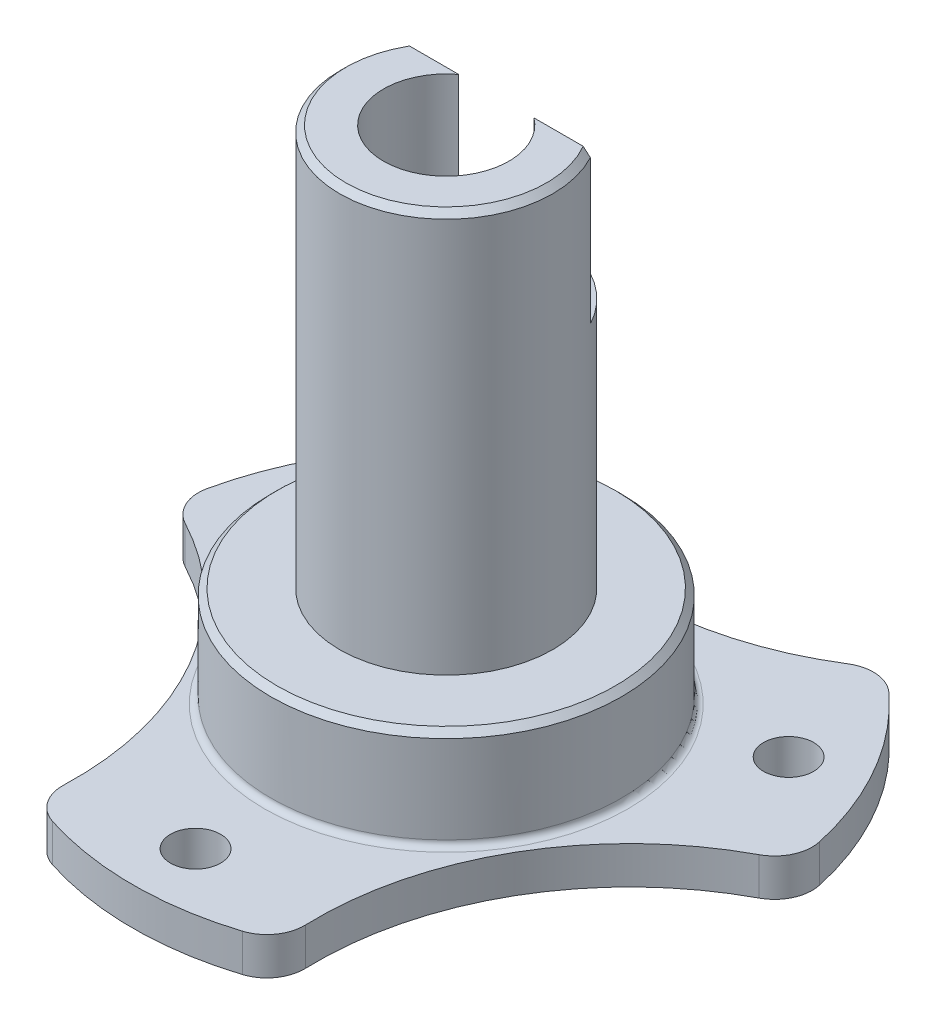
ISO-10303-21;
HEADER;
FILE_DESCRIPTION(('STEP AP214'),'2;1');
FILE_NAME('part.step','',(''),(''),'','','');
FILE_SCHEMA(('AUTOMOTIVE_DESIGN { 1 0 10303 214 1 1 1 1 }'));
ENDSEC;
DATA;
#1=APPLICATION_CONTEXT('core data for automotive mechanical design processes');
#2=APPLICATION_PROTOCOL_DEFINITION('international standard','automotive_design',2000,#1);
#3=PRODUCT_CONTEXT('',#1,'mechanical');
#4=PRODUCT('Part','Part','',(#3));
#5=PRODUCT_RELATED_PRODUCT_CATEGORY('part','',(#4));
#6=PRODUCT_DEFINITION_FORMATION('','',#4);
#7=PRODUCT_DEFINITION_CONTEXT('part definition',#1,'design');
#8=PRODUCT_DEFINITION('design','',#6,#7);
#9=PRODUCT_DEFINITION_SHAPE('','',#8);
#10=(LENGTH_UNIT() NAMED_UNIT(*) SI_UNIT(.MILLI.,.METRE.));
#11=(NAMED_UNIT(*) PLANE_ANGLE_UNIT() SI_UNIT($,.RADIAN.));
#12=(NAMED_UNIT(*) SI_UNIT($,.STERADIAN.) SOLID_ANGLE_UNIT());
#13=UNCERTAINTY_MEASURE_WITH_UNIT(LENGTH_MEASURE(1.E-05),#10,'distance_accuracy_value','');
#14=(GEOMETRIC_REPRESENTATION_CONTEXT(3) GLOBAL_UNCERTAINTY_ASSIGNED_CONTEXT((#13)) GLOBAL_UNIT_ASSIGNED_CONTEXT((#10,
#11,#12)) REPRESENTATION_CONTEXT('',''));
#15=CARTESIAN_POINT('',(0.,0.,0.));
#16=DIRECTION('',(0.,0.,1.));
#17=DIRECTION('',(1.,0.,0.));
#18=AXIS2_PLACEMENT_3D('',#15,#16,#17);
#19=CARTESIAN_POINT('',(0.,-3.,0.));
#20=DIRECTION('',(0.,1.,0.));
#21=DIRECTION('',(0.,0.,1.));
#22=AXIS2_PLACEMENT_3D('',#19,#20,#21);
#23=CYLINDRICAL_SURFACE('',#22,25.);
#24=CARTESIAN_POINT('',(0.,-3.,0.));
#25=DIRECTION('',(0.,-1.,0.));
#26=DIRECTION('',(0.,0.,-1.));
#27=AXIS2_PLACEMENT_3D('',#24,#25,#26);
#28=CIRCLE('',#27,25.);
#29=CARTESIAN_POINT('',(-24.4182474846353,-3.,-5.361827093361));
#30=VERTEX_POINT('',#29);
#31=CARTESIAN_POINT('',(-16.8526022158681,-3.,-18.4659090909091));
#32=VERTEX_POINT('',#31);
#33=EDGE_CURVE('E239',#30,#32,#28,.T.);
#34=ORIENTED_EDGE('',*,*,#33,.F.);
#35=DIRECTION('',(0.,1.,0.));
#36=VECTOR('',#35,1.);
#37=CARTESIAN_POINT('',(-24.4182474846353,-3.,-5.361827093361));
#38=LINE('',#37,#36);
#39=CARTESIAN_POINT('',(-24.4182474846353,0.,-5.361827093361));
#40=VERTEX_POINT('',#39);
#41=EDGE_CURVE('E279',#30,#40,#38,.T.);
#42=ORIENTED_EDGE('',*,*,#41,.T.);
#43=CARTESIAN_POINT('',(0.,0.,0.));
#44=DIRECTION('',(0.,-1.,0.));
#45=DIRECTION('',(0.,0.,-1.));
#46=AXIS2_PLACEMENT_3D('',#43,#44,#45);
#47=CIRCLE('',#46,25.);
#48=CARTESIAN_POINT('',(-16.8526022158681,0.,-18.4659090909091));
#49=VERTEX_POINT('',#48);
#50=EDGE_CURVE('E202',#40,#49,#47,.T.);
#51=ORIENTED_EDGE('',*,*,#50,.T.);
#52=DIRECTION('',(0.,1.,0.));
#53=VECTOR('',#52,1.);
#54=CARTESIAN_POINT('',(-16.8526022158681,-3.,-18.4659090909091));
#55=LINE('',#54,#53);
#56=EDGE_CURVE('E276',#49,#32,#55,.F.);
#57=ORIENTED_EDGE('',*,*,#56,.T.);
#58=EDGE_LOOP('',(#34,#42,#51,#57));
#59=FACE_BOUND('',#58,.T.);
#60=ADVANCED_FACE('F47',(#59),#23,.T.);
#61=CARTESIAN_POINT('',(16.8526022158681,-3.,-18.4659090909091));
#62=VERTEX_POINT('',#61);
#63=CARTESIAN_POINT('',(24.4182474846353,-3.,-5.36182709336134));
#64=VERTEX_POINT('',#63);
#65=EDGE_CURVE('E238',#62,#64,#28,.T.);
#66=ORIENTED_EDGE('',*,*,#65,.F.);
#67=DIRECTION('',(0.,1.,0.));
#68=VECTOR('',#67,1.);
#69=CARTESIAN_POINT('',(16.8526022158681,-3.,-18.4659090909091));
#70=LINE('',#69,#68);
#71=CARTESIAN_POINT('',(16.8526022158681,0.,-18.4659090909091));
#72=VERTEX_POINT('',#71);
#73=EDGE_CURVE('E317',#62,#72,#70,.T.);
#74=ORIENTED_EDGE('',*,*,#73,.T.);
#75=CARTESIAN_POINT('',(24.4182474846353,0.,-5.36182709336134));
#76=VERTEX_POINT('',#75);
#77=EDGE_CURVE('E243',#72,#76,#47,.T.);
#78=ORIENTED_EDGE('',*,*,#77,.T.);
#79=DIRECTION('',(0.,1.,0.));
#80=VECTOR('',#79,1.);
#81=CARTESIAN_POINT('',(24.4182474846353,-3.,-5.36182709336134));
#82=LINE('',#81,#80);
#83=EDGE_CURVE('E314',#76,#64,#82,.F.);
#84=ORIENTED_EDGE('',*,*,#83,.T.);
#85=EDGE_LOOP('',(#66,#74,#78,#84));
#86=FACE_BOUND('',#85,.T.);
#87=ADVANCED_FACE('F376',(#86),#23,.T.);
#88=CARTESIAN_POINT('',(0.,28.,0.));
#89=DIRECTION('',(0.,1.,0.));
#90=DIRECTION('',(0.,0.,1.));
#91=AXIS2_PLACEMENT_3D('',#88,#89,#90);
#92=PLANE('',#91);
#93=CARTESIAN_POINT('',(0.,28.,0.));
#94=DIRECTION('',(0.,1.,0.));
#95=DIRECTION('',(0.,0.,1.));
#96=AXIS2_PLACEMENT_3D('',#93,#94,#95);
#97=CIRCLE('',#96,8.5);
#98=CARTESIAN_POINT('',(7.5,28.,-4.));
#99=VERTEX_POINT('',#98);
#100=CARTESIAN_POINT('',(-7.5,28.,-4.));
#101=VERTEX_POINT('',#100);
#102=EDGE_CURVE('E264',#99,#101,#97,.T.);
#103=ORIENTED_EDGE('',*,*,#102,.T.);
#104=DIRECTION('',(1.,0.,0.));
#105=VECTOR('',#104,1.);
#106=CARTESIAN_POINT('',(0.,28.,-4.));
#107=LINE('',#106,#105);
#108=CARTESIAN_POINT('',(-3.,28.,-4.));
#109=VERTEX_POINT('',#108);
#110=EDGE_CURVE('E247',#101,#109,#107,.T.);
#111=ORIENTED_EDGE('',*,*,#110,.T.);
#112=CARTESIAN_POINT('',(0.,28.,0.));
#113=DIRECTION('',(0.,1.,0.));
#114=DIRECTION('',(0.,0.,1.));
#115=AXIS2_PLACEMENT_3D('',#112,#113,#114);
#116=CIRCLE('',#115,5.);
#117=CARTESIAN_POINT('',(3.,28.,-4.));
#118=VERTEX_POINT('',#117);
#119=EDGE_CURVE('E177',#118,#109,#116,.T.);
#120=ORIENTED_EDGE('',*,*,#119,.F.);
#121=EDGE_CURVE('E182',#118,#99,#107,.T.);
#122=ORIENTED_EDGE('',*,*,#121,.T.);
#123=EDGE_LOOP('',(#103,#111,#120,#122));
#124=FACE_BOUND('',#123,.T.);
#125=ADVANCED_FACE('F368',(#124),#92,.T.);
#126=CARTESIAN_POINT('',(0.,21.,0.));
#127=DIRECTION('',(0.,1.,0.));
#128=DIRECTION('',(0.,0.,1.));
#129=AXIS2_PLACEMENT_3D('',#126,#127,#128);
#130=CYLINDRICAL_SURFACE('',#129,2.75);
#131=CARTESIAN_POINT('',(0.,21.,0.));
#132=DIRECTION('',(0.,1.,0.));
#133=DIRECTION('',(0.,0.,1.));
#134=AXIS2_PLACEMENT_3D('',#131,#132,#133);
#135=CIRCLE('',#134,2.75);
#136=CARTESIAN_POINT('',(0.,21.,2.75));
#137=VERTEX_POINT('',#136);
#138=EDGE_CURVE('E260',#137,#137,#135,.T.);
#139=ORIENTED_EDGE('',*,*,#138,.F.);
#140=EDGE_LOOP('',(#139));
#141=FACE_BOUND('',#140,.T.);
#142=CARTESIAN_POINT('',(0.,24.7,0.));
#143=DIRECTION('',(0.,1.,0.));
#144=DIRECTION('',(0.,0.,1.));
#145=AXIS2_PLACEMENT_3D('',#142,#143,#144);
#146=CIRCLE('',#145,2.75);
#147=CARTESIAN_POINT('',(0.,24.7,2.75));
#148=VERTEX_POINT('',#147);
#149=EDGE_CURVE('E254',#148,#148,#146,.T.);
#150=ORIENTED_EDGE('',*,*,#149,.T.);
#151=EDGE_LOOP('',(#150));
#152=FACE_BOUND('',#151,.T.);
#153=ADVANCED_FACE('F364',(#141,#152),#130,.F.);
#154=CARTESIAN_POINT('',(0.,8.,0.));
#155=DIRECTION('',(0.,-1.,0.));
#156=DIRECTION('',(0.,0.,-1.));
#157=AXIS2_PLACEMENT_3D('',#154,#155,#156);
#158=CYLINDRICAL_SURFACE('',#157,14.);
#159=CARTESIAN_POINT('',(0.,0.5,0.));
#160=DIRECTION('',(0.,-1.,0.));
#161=DIRECTION('',(0.,0.,-1.));
#162=AXIS2_PLACEMENT_3D('',#159,#160,#161);
#163=CIRCLE('',#162,14.);
#164=CARTESIAN_POINT('',(0.,0.5,-14.));
#165=VERTEX_POINT('',#164);
#166=EDGE_CURVE('E330',#165,#165,#163,.F.);
#167=ORIENTED_EDGE('',*,*,#166,.T.);
#168=EDGE_LOOP('',(#167));
#169=FACE_BOUND('',#168,.T.);
#170=CARTESIAN_POINT('',(0.,7.49999999999999,0.));
#171=DIRECTION('',(0.,1.,0.));
#172=DIRECTION('',(0.,0.,1.));
#173=AXIS2_PLACEMENT_3D('',#170,#171,#172);
#174=CIRCLE('',#173,14.);
#175=CARTESIAN_POINT('',(0.,7.49999999999999,14.));
#176=VERTEX_POINT('',#175);
#177=EDGE_CURVE('E273',#176,#176,#174,.F.);
#178=ORIENTED_EDGE('',*,*,#177,.T.);
#179=EDGE_LOOP('',(#178));
#180=FACE_BOUND('',#179,.T.);
#181=ADVANCED_FACE('F367',(#169,#180),#158,.T.);
#182=CARTESIAN_POINT('',(0.,8.,0.));
#183=DIRECTION('',(0.,1.,0.));
#184=DIRECTION('',(0.,0.,1.));
#185=AXIS2_PLACEMENT_3D('',#182,#183,#184);
#186=PLANE('',#185);
#187=CARTESIAN_POINT('',(0.,8.,0.));
#188=DIRECTION('',(0.,1.,0.));
#189=DIRECTION('',(0.,0.,1.));
#190=AXIS2_PLACEMENT_3D('',#187,#188,#189);
#191=CIRCLE('',#190,13.5);
#192=CARTESIAN_POINT('',(0.,8.,13.5));
#193=VERTEX_POINT('',#192);
#194=EDGE_CURVE('E270',#193,#193,#191,.T.);
#195=ORIENTED_EDGE('',*,*,#194,.T.);
#196=EDGE_LOOP('',(#195));
#197=FACE_BOUND('',#196,.T.);
#198=CARTESIAN_POINT('',(0.,8.,0.));
#199=DIRECTION('',(0.,1.,0.));
#200=DIRECTION('',(0.,0.,1.));
#201=AXIS2_PLACEMENT_3D('',#198,#199,#200);
#202=CIRCLE('',#201,8.5);
#203=CARTESIAN_POINT('',(0.,8.,8.5));
#204=VERTEX_POINT('',#203);
#205=EDGE_CURVE('E267',#204,#204,#202,.T.);
#206=ORIENTED_EDGE('',*,*,#205,.F.);
#207=EDGE_LOOP('',(#206));
#208=FACE_BOUND('',#207,.T.);
#209=ADVANCED_FACE('F380',(#197,#208),#186,.T.);
#210=CARTESIAN_POINT('',(0.,28.,0.));
#211=DIRECTION('',(0.,-1.,0.));
#212=DIRECTION('',(0.,0.,-1.));
#213=AXIS2_PLACEMENT_3D('',#210,#211,#212);
#214=CYLINDRICAL_SURFACE('',#213,8.5);
#215=DIRECTION('',(0.,-1.,0.));
#216=VECTOR('',#215,1.);
#217=CARTESIAN_POINT('',(7.5,34.,-4.));
#218=LINE('',#217,#216);
#219=CARTESIAN_POINT('',(7.5,39.5,-4.));
#220=VERTEX_POINT('',#219);
#221=EDGE_CURVE('E250',#220,#99,#218,.T.);
#222=ORIENTED_EDGE('',*,*,#221,.F.);
#223=CARTESIAN_POINT('',(0.,39.5,0.));
#224=DIRECTION('',(0.,1.,0.));
#225=DIRECTION('',(0.,0.,1.));
#226=AXIS2_PLACEMENT_3D('',#223,#224,#225);
#227=CIRCLE('',#226,8.5);
#228=CARTESIAN_POINT('',(-7.5,39.5,-4.));
#229=VERTEX_POINT('',#228);
#230=EDGE_CURVE('E62',#220,#229,#227,.F.);
#231=ORIENTED_EDGE('',*,*,#230,.T.);
#232=DIRECTION('',(0.,-1.,0.));
#233=VECTOR('',#232,1.);
#234=CARTESIAN_POINT('',(-7.5,34.,-4.));
#235=LINE('',#234,#233);
#236=EDGE_CURVE('E252',#229,#101,#235,.T.);
#237=ORIENTED_EDGE('',*,*,#236,.T.);
#238=ORIENTED_EDGE('',*,*,#102,.F.);
#239=EDGE_LOOP('',(#222,#231,#237,#238));
#240=FACE_BOUND('',#239,.T.);
#241=ORIENTED_EDGE('',*,*,#205,.T.);
#242=EDGE_LOOP('',(#241));
#243=FACE_BOUND('',#242,.T.);
#244=ADVANCED_FACE('F372',(#240,#243),#214,.T.);
#245=CARTESIAN_POINT('',(0.,21.,0.));
#246=DIRECTION('',(0.,1.,0.));
#247=DIRECTION('',(0.,0.,1.));
#248=AXIS2_PLACEMENT_3D('',#245,#246,#247);
#249=PLANE('',#248);
#250=ORIENTED_EDGE('',*,*,#138,.T.);
#251=EDGE_LOOP('',(#250));
#252=FACE_BOUND('',#251,.T.);
#253=CARTESIAN_POINT('',(0.,21.,0.));
#254=DIRECTION('',(0.,-1.,0.));
#255=DIRECTION('',(0.,0.,-1.));
#256=AXIS2_PLACEMENT_3D('',#253,#254,#255);
#257=CIRCLE('',#256,6.);
#258=CARTESIAN_POINT('',(0.,21.,-6.));
#259=VERTEX_POINT('',#258);
#260=EDGE_CURVE('E244',#259,#259,#257,.T.);
#261=ORIENTED_EDGE('',*,*,#260,.T.);
#262=EDGE_LOOP('',(#261));
#263=FACE_BOUND('',#262,.T.);
#264=ADVANCED_FACE('F362',(#252,#263),#249,.F.);
#265=CARTESIAN_POINT('',(0.,24.7,0.));
#266=DIRECTION('',(0.,1.,0.));
#267=DIRECTION('',(0.,0.,1.));
#268=AXIS2_PLACEMENT_3D('',#265,#266,#267);
#269=CYLINDRICAL_SURFACE('',#268,5.);
#270=CARTESIAN_POINT('',(0.,24.7,0.));
#271=DIRECTION('',(0.,1.,0.));
#272=DIRECTION('',(0.,0.,1.));
#273=AXIS2_PLACEMENT_3D('',#270,#271,#272);
#274=CIRCLE('',#273,5.);
#275=CARTESIAN_POINT('',(0.,24.7,5.));
#276=VERTEX_POINT('',#275);
#277=EDGE_CURVE('E257',#276,#276,#274,.T.);
#278=ORIENTED_EDGE('',*,*,#277,.F.);
#279=EDGE_LOOP('',(#278));
#280=FACE_BOUND('',#279,.T.);
#281=ORIENTED_EDGE('',*,*,#119,.T.);
#282=DIRECTION('',(0.,-1.,0.));
#283=VECTOR('',#282,1.);
#284=CARTESIAN_POINT('',(-3.,34.,-4.));
#285=LINE('',#284,#283);
#286=CARTESIAN_POINT('',(-3.,40.,-4.));
#287=VERTEX_POINT('',#286);
#288=EDGE_CURVE('E171',#287,#109,#285,.T.);
#289=ORIENTED_EDGE('',*,*,#288,.F.);
#290=CARTESIAN_POINT('',(0.,40.,0.));
#291=DIRECTION('',(0.,-1.,0.));
#292=DIRECTION('',(0.,0.,1.));
#293=AXIS2_PLACEMENT_3D('',#290,#291,#292);
#294=CIRCLE('',#293,5.);
#295=CARTESIAN_POINT('',(3.,40.,-4.));
#296=VERTEX_POINT('',#295);
#297=EDGE_CURVE('E175',#296,#287,#294,.T.);
#298=ORIENTED_EDGE('',*,*,#297,.F.);
#299=DIRECTION('',(0.,-1.,0.));
#300=VECTOR('',#299,1.);
#301=CARTESIAN_POINT('',(3.,34.,-4.));
#302=LINE('',#301,#300);
#303=EDGE_CURVE('E181',#296,#118,#302,.T.);
#304=ORIENTED_EDGE('',*,*,#303,.T.);
#305=EDGE_LOOP('',(#281,#289,#298,#304));
#306=FACE_BOUND('',#305,.T.);
#307=ADVANCED_FACE('F173',(#280,#306),#269,.F.);
#308=CARTESIAN_POINT('',(0.,24.7,0.));
#309=DIRECTION('',(0.,1.,0.));
#310=DIRECTION('',(0.,0.,1.));
#311=AXIS2_PLACEMENT_3D('',#308,#309,#310);
#312=PLANE('',#311);
#313=ORIENTED_EDGE('',*,*,#149,.F.);
#314=EDGE_LOOP('',(#313));
#315=FACE_BOUND('',#314,.T.);
#316=ORIENTED_EDGE('',*,*,#277,.T.);
#317=EDGE_LOOP('',(#316));
#318=FACE_BOUND('',#317,.T.);
#319=ADVANCED_FACE('F355',(#315,#318),#312,.T.);
#320=CARTESIAN_POINT('',(0.,34.,-4.));
#321=DIRECTION('',(0.,0.,-1.));
#322=DIRECTION('',(-1.,0.,0.));
#323=AXIS2_PLACEMENT_3D('',#320,#321,#322);
#324=PLANE('',#323);
#325=ORIENTED_EDGE('',*,*,#236,.F.);
#326=CARTESIAN_POINT('',(-7.5,39.5,-4.));
#327=CARTESIAN_POINT('',(-7.40508572762608,39.583773802137,-4.));
#328=CARTESIAN_POINT('',(-7.30997886837291,39.6673273631633,-4.));
#329=CARTESIAN_POINT('',(-7.11937994525611,39.8339940299726,-4.));
#330=CARTESIAN_POINT('',(-7.02388788126778,39.9171071356129,-4.));
#331=CARTESIAN_POINT('',(-6.92820323027551,40.,-4.));
#332=B_SPLINE_CURVE_WITH_KNOTS('',3,(#326,#327,#328,#329,#330,#331),.UNSPECIFIED.,.F.,.F.,(4,2,
4),(0.,0.379787585545629,0.759575294042707),.UNSPECIFIED.);
#333=CARTESIAN_POINT('',(-6.92820323027551,40.,-4.));
#334=VERTEX_POINT('',#333);
#335=EDGE_CURVE('E11',#229,#334,#332,.T.);
#336=ORIENTED_EDGE('',*,*,#335,.T.);
#337=DIRECTION('',(-1.,0.,0.));
#338=VECTOR('',#337,1.);
#339=CARTESIAN_POINT('',(-7.5,40.,-4.));
#340=LINE('',#339,#338);
#341=EDGE_CURVE('E185',#287,#334,#340,.T.);
#342=ORIENTED_EDGE('',*,*,#341,.F.);
#343=ORIENTED_EDGE('',*,*,#288,.T.);
#344=ORIENTED_EDGE('',*,*,#110,.F.);
#345=EDGE_LOOP('',(#325,#336,#342,#343,#344));
#346=FACE_BOUND('',#345,.T.);
#347=ADVANCED_FACE('F186',(#346),#324,.T.);
#348=DIRECTION('',(-1.,0.,0.));
#349=VECTOR('',#348,1.);
#350=CARTESIAN_POINT('',(3.,40.,-4.));
#351=LINE('',#350,#349);
#352=CARTESIAN_POINT('',(6.92820323027551,40.,-4.));
#353=VERTEX_POINT('',#352);
#354=EDGE_CURVE('E191',#353,#296,#351,.T.);
#355=ORIENTED_EDGE('',*,*,#354,.F.);
#356=CARTESIAN_POINT('',(6.92820323027551,40.,-4.));
#357=CARTESIAN_POINT('',(7.02388788126778,39.9171071356129,-4.));
#358=CARTESIAN_POINT('',(7.11937994525611,39.8339940299726,-4.));
#359=CARTESIAN_POINT('',(7.30997886837291,39.6673273631633,-4.));
#360=CARTESIAN_POINT('',(7.40508572762608,39.583773802137,-4.));
#361=CARTESIAN_POINT('',(7.5,39.5,-4.));
#362=B_SPLINE_CURVE_WITH_KNOTS('',3,(#356,#357,#358,#359,#360,#361),.UNSPECIFIED.,.F.,.F.,(4,2,
4),(0.,0.379787708497077,0.759575294042706),.UNSPECIFIED.);
#363=EDGE_CURVE('E76',#353,#220,#362,.T.);
#364=ORIENTED_EDGE('',*,*,#363,.T.);
#365=ORIENTED_EDGE('',*,*,#221,.T.);
#366=ORIENTED_EDGE('',*,*,#121,.F.);
#367=ORIENTED_EDGE('',*,*,#303,.F.);
#368=EDGE_LOOP('',(#355,#364,#365,#366,#367));
#369=FACE_BOUND('',#368,.T.);
#370=ADVANCED_FACE('F348',(#369),#324,.T.);
#371=CARTESIAN_POINT('',(0.,21.,0.));
#372=DIRECTION('',(0.,-1.,0.));
#373=DIRECTION('',(0.,0.,-1.));
#374=AXIS2_PLACEMENT_3D('',#371,#372,#373);
#375=CYLINDRICAL_SURFACE('',#374,6.);
#376=CARTESIAN_POINT('',(0.,-2.49999999999997,0.));
#377=DIRECTION('',(0.,-1.,0.));
#378=DIRECTION('',(0.,0.,-1.));
#379=AXIS2_PLACEMENT_3D('',#376,#377,#378);
#380=CIRCLE('',#379,6.);
#381=CARTESIAN_POINT('',(0.,-2.49999999999997,-6.));
#382=VERTEX_POINT('',#381);
#383=EDGE_CURVE('E336',#382,#382,#380,.T.);
#384=CARTESIAN_POINT('',(0.,-2.49999999999997,-6.));
#385=CARTESIAN_POINT('',(0.,-2.2552083333333,-6.));
#386=CARTESIAN_POINT('',(0.,-2.01041666666663,-6.));
#387=CARTESIAN_POINT('',(0.,-1.5208333333333,-6.));
#388=CARTESIAN_POINT('',(0.,-1.27604166666664,-6.));
#389=CARTESIAN_POINT('',(0.,-0.786458333333303,-6.));
#390=CARTESIAN_POINT('',(0.,-0.541666666666637,-6.));
#391=CARTESIAN_POINT('',(0.,-0.0520833333333044,-6.));
#392=CARTESIAN_POINT('',(0.,0.192708333333362,-6.));
#393=CARTESIAN_POINT('',(0.,0.682291666666694,-6.));
#394=CARTESIAN_POINT('',(0.,0.927083333333361,-6.));
#395=CARTESIAN_POINT('',(0.,1.41666666666669,-6.));
#396=CARTESIAN_POINT('',(0.,1.66145833333336,-6.));
#397=CARTESIAN_POINT('',(0.,2.15104166666669,-6.));
#398=CARTESIAN_POINT('',(0.,2.39583333333336,-6.));
#399=CARTESIAN_POINT('',(0.,2.88541666666669,-6.));
#400=CARTESIAN_POINT('',(0.,3.13020833333336,-6.));
#401=CARTESIAN_POINT('',(0.,3.61979166666669,-6.));
#402=CARTESIAN_POINT('',(0.,3.86458333333336,-6.));
#403=CARTESIAN_POINT('',(0.,4.35416666666669,-6.));
#404=CARTESIAN_POINT('',(0.,4.59895833333336,-6.));
#405=CARTESIAN_POINT('',(0.,5.08854166666669,-6.));
#406=CARTESIAN_POINT('',(0.,5.33333333333335,-6.));
#407=CARTESIAN_POINT('',(0.,5.82291666666669,-6.));
#408=CARTESIAN_POINT('',(0.,6.06770833333335,-6.));
#409=CARTESIAN_POINT('',(0.,6.55729166666669,-6.));
#410=CARTESIAN_POINT('',(0.,6.80208333333335,-6.));
#411=CARTESIAN_POINT('',(0.,7.29166666666669,-6.));
#412=CARTESIAN_POINT('',(0.,7.53645833333335,-6.));
#413=CARTESIAN_POINT('',(0.,8.02604166666669,-6.));
#414=CARTESIAN_POINT('',(0.,8.27083333333335,-6.));
#415=CARTESIAN_POINT('',(0.,8.76041666666668,-6.));
#416=CARTESIAN_POINT('',(0.,9.00520833333335,-6.));
#417=CARTESIAN_POINT('',(0.,9.49479166666668,-6.));
#418=CARTESIAN_POINT('',(0.,9.73958333333335,-6.));
#419=CARTESIAN_POINT('',(0.,10.2291666666667,-6.));
#420=CARTESIAN_POINT('',(0.,10.4739583333333,-6.));
#421=CARTESIAN_POINT('',(0.,10.9635416666667,-6.));
#422=CARTESIAN_POINT('',(0.,11.2083333333333,-6.));
#423=CARTESIAN_POINT('',(0.,11.6979166666667,-6.));
#424=CARTESIAN_POINT('',(0.,11.9427083333333,-6.));
#425=CARTESIAN_POINT('',(0.,12.4322916666667,-6.));
#426=CARTESIAN_POINT('',(0.,12.6770833333333,-6.));
#427=CARTESIAN_POINT('',(0.,13.1666666666667,-6.));
#428=CARTESIAN_POINT('',(0.,13.4114583333333,-6.));
#429=CARTESIAN_POINT('',(0.,13.9010416666667,-6.));
#430=CARTESIAN_POINT('',(0.,14.1458333333333,-6.));
#431=CARTESIAN_POINT('',(0.,14.6354166666667,-6.));
#432=CARTESIAN_POINT('',(0.,14.8802083333333,-6.));
#433=CARTESIAN_POINT('',(0.,15.3697916666667,-6.));
#434=CARTESIAN_POINT('',(0.,15.6145833333333,-6.));
#435=CARTESIAN_POINT('',(0.,16.1041666666667,-6.));
#436=CARTESIAN_POINT('',(0.,16.3489583333333,-6.));
#437=CARTESIAN_POINT('',(0.,16.8385416666667,-6.));
#438=CARTESIAN_POINT('',(0.,17.0833333333333,-6.));
#439=CARTESIAN_POINT('',(0.,17.5729166666667,-6.));
#440=CARTESIAN_POINT('',(0.,17.8177083333333,-6.));
#441=CARTESIAN_POINT('',(0.,18.3072916666667,-6.));
#442=CARTESIAN_POINT('',(0.,18.5520833333333,-6.));
#443=CARTESIAN_POINT('',(0.,19.0416666666667,-6.));
#444=CARTESIAN_POINT('',(0.,19.2864583333333,-6.));
#445=CARTESIAN_POINT('',(0.,19.7760416666667,-6.));
#446=CARTESIAN_POINT('',(0.,20.0208333333333,-6.));
#447=CARTESIAN_POINT('',(0.,20.5104166666667,-6.));
#448=CARTESIAN_POINT('',(0.,20.7552083333333,-6.));
#449=CARTESIAN_POINT('',(0.,21.,-6.));
#450=B_SPLINE_CURVE_WITH_KNOTS('',3,(#384,#385,#386,#387,#388,#389,#390,#391,#392,#393,#394,
#395,#396,#397,#398,#399,#400,#401,#402,#403,#404,#405,#406,#407,#408,#409,#410,#411,#412,#413,
#414,#415,#416,#417,#418,#419,#420,#421,#422,#423,#424,#425,#426,#427,#428,#429,#430,#431,#432,
#433,#434,#435,#436,#437,#438,#439,#440,#441,#442,#443,#444,#445,#446,#447,#448,#449),
.UNSPECIFIED.,.F.,.F.,(4,2,2,2,2,2,2,2,2,2,2,2,2,2,2,2,2,2,2,2,2,2,2,2,2,2,2,2,2,2,2,2,4),(0.,
0.734374999999999,1.46875,2.203125,2.9375,3.67187499999999,4.40624999999999,5.140625,
5.87499999999999,6.60937499999999,7.34374999999999,8.07812499999999,8.81249999999999,
9.54687499999999,10.28125,11.015625,11.75,12.484375,13.21875,13.953125,14.6875,15.421875,
16.15625,16.890625,17.625,18.359375,19.09375,19.828125,20.5625,21.296875,22.03125,22.765625,
23.5),.UNSPECIFIED.);
#451=EDGE_CURVE('BSEAM353',#382,#259,#450,.T.);
#452=ORIENTED_EDGE('',*,*,#383,.T.);
#453=ORIENTED_EDGE('',*,*,#260,.F.);
#454=ORIENTED_EDGE('',*,*,#451,.T.);
#455=ORIENTED_EDGE('',*,*,#451,.F.);
#456=EDGE_LOOP('',(#452,#454,#453,#455));
#457=FACE_BOUND('',#456,.T.);
#458=ADVANCED_FACE('F353',(#457),#375,.F.);
#459=CARTESIAN_POINT('',(0.,8.,0.));
#460=DIRECTION('',(0.,-1.,0.));
#461=DIRECTION('',(0.,0.,-1.));
#462=AXIS2_PLACEMENT_3D('',#459,#460,#461);
#463=CONICAL_SURFACE('',#462,13.5,0.785398163397448);
#464=ORIENTED_EDGE('',*,*,#177,.F.);
#465=EDGE_LOOP('',(#464));
#466=FACE_BOUND('',#465,.T.);
#467=ORIENTED_EDGE('',*,*,#194,.F.);
#468=EDGE_LOOP('',(#467));
#469=FACE_BOUND('',#468,.T.);
#470=ADVANCED_FACE('F388',(#466,#469),#463,.T.);
#471=CARTESIAN_POINT('',(0.,0.,0.));
#472=DIRECTION('',(0.,-1.,0.));
#473=DIRECTION('',(0.,0.,-1.));
#474=AXIS2_PLACEMENT_3D('',#471,#472,#473);
#475=PLANE('',#474);
#476=CARTESIAN_POINT('',(0.,0.,0.));
#477=DIRECTION('',(0.,-1.,0.));
#478=DIRECTION('',(0.,0.,-1.));
#479=AXIS2_PLACEMENT_3D('',#476,#477,#478);
#480=CIRCLE('',#479,14.5);
#481=CARTESIAN_POINT('',(0.,0.,-14.5));
#482=VERTEX_POINT('',#481);
#483=EDGE_CURVE('E333',#482,#482,#480,.T.);
#484=ORIENTED_EDGE('',*,*,#483,.T.);
#485=EDGE_LOOP('',(#484));
#486=FACE_BOUND('',#485,.T.);
#487=CARTESIAN_POINT('',(-17.3205080756889,0.,-9.99999999999984));
#488=DIRECTION('',(0.,-1.,0.));
#489=DIRECTION('',(0.,0.,-1.));
#490=AXIS2_PLACEMENT_3D('',#487,#488,#489);
#491=CIRCLE('',#490,2.);
#492=CARTESIAN_POINT('',(-17.3205080756889,0.,-11.9999999999998));
#493=VERTEX_POINT('',#492);
#494=EDGE_CURVE('E207',#493,#493,#491,.T.);
#495=ORIENTED_EDGE('',*,*,#494,.T.);
#496=EDGE_LOOP('',(#495));
#497=FACE_BOUND('',#496,.T.);
#498=CARTESIAN_POINT('',(17.3205080756887,0.,-10.0000000000001));
#499=DIRECTION('',(0.,-1.,0.));
#500=DIRECTION('',(0.,0.,-1.));
#501=AXIS2_PLACEMENT_3D('',#498,#499,#500);
#502=CIRCLE('',#501,2.);
#503=CARTESIAN_POINT('',(17.3205080756887,0.,-12.0000000000001));
#504=VERTEX_POINT('',#503);
#505=EDGE_CURVE('E224',#504,#504,#502,.T.);
#506=ORIENTED_EDGE('',*,*,#505,.T.);
#507=EDGE_LOOP('',(#506));
#508=FACE_BOUND('',#507,.T.);
#509=CARTESIAN_POINT('',(0.,0.,20.));
#510=DIRECTION('',(0.,-1.,0.));
#511=DIRECTION('',(0.,0.,-1.));
#512=AXIS2_PLACEMENT_3D('',#509,#510,#511);
#513=CIRCLE('',#512,2.);
#514=CARTESIAN_POINT('',(0.,0.,18.));
#515=VERTEX_POINT('',#514);
#516=EDGE_CURVE('E206',#515,#515,#513,.T.);
#517=ORIENTED_EDGE('',*,*,#516,.T.);
#518=EDGE_LOOP('',(#517));
#519=FACE_BOUND('',#518,.T.);
#520=ORIENTED_EDGE('',*,*,#50,.F.);
#521=CARTESIAN_POINT('',(-21.4880577864791,0.,-4.71840784215768));
#522=DIRECTION('',(0.,-1.,0.));
#523=DIRECTION('',(0.,0.,-1.));
#524=AXIS2_PLACEMENT_3D('',#521,#522,#523);
#525=CIRCLE('',#524,3.);
#526=CARTESIAN_POINT('',(-22.8973033255754,0.,-2.07000700192648));
#527=VERTEX_POINT('',#526);
#528=EDGE_CURVE('E292',#40,#527,#525,.F.);
#529=ORIENTED_EDGE('',*,*,#528,.T.);
#530=CARTESIAN_POINT('',(-34.6410161513775,0.,20.0000000000002));
#531=DIRECTION('',(0.,-1.,0.));
#532=DIRECTION('',(0.,0.,-1.));
#533=AXIS2_PLACEMENT_3D('',#530,#531,#532);
#534=CIRCLE('',#533,25.);
#535=CARTESIAN_POINT('',(-9.65597301310749,0.,20.8646498590695));
#536=VERTEX_POINT('',#535);
#537=EDGE_CURVE('E218',#527,#536,#534,.T.);
#538=ORIENTED_EDGE('',*,*,#537,.T.);
#539=CARTESIAN_POINT('',(-6.65776783651509,0.,20.9684078421578));
#540=DIRECTION('',(0.,-1.,0.));
#541=DIRECTION('',(0.,0.,-1.));
#542=AXIS2_PLACEMENT_3D('',#539,#540,#541);
#543=CIRCLE('',#542,3.);
#544=CARTESIAN_POINT('',(-7.56564526876715,0.,23.8277361842702));
#545=VERTEX_POINT('',#544);
#546=EDGE_CURVE('E282',#536,#545,#543,.F.);
#547=ORIENTED_EDGE('',*,*,#546,.T.);
#548=CARTESIAN_POINT('',(7.56564526876748,0.,23.8277361842701));
#549=VERTEX_POINT('',#548);
#550=EDGE_CURVE('E240',#549,#545,#47,.T.);
#551=ORIENTED_EDGE('',*,*,#550,.F.);
#552=CARTESIAN_POINT('',(6.65776783651538,0.,20.9684078421577));
#553=DIRECTION('',(0.,-1.,0.));
#554=DIRECTION('',(0.,0.,-1.));
#555=AXIS2_PLACEMENT_3D('',#552,#553,#554);
#556=CIRCLE('',#555,3.);
#557=CARTESIAN_POINT('',(9.65597301310778,0.,20.8646498590694));
#558=VERTEX_POINT('',#557);
#559=EDGE_CURVE('E284',#549,#558,#556,.F.);
#560=ORIENTED_EDGE('',*,*,#559,.T.);
#561=CARTESIAN_POINT('',(34.6410161513777,0.,19.9999999999997));
#562=DIRECTION('',(0.,-1.,0.));
#563=DIRECTION('',(0.,0.,-1.));
#564=AXIS2_PLACEMENT_3D('',#561,#562,#563);
#565=CIRCLE('',#564,25.);
#566=CARTESIAN_POINT('',(22.8973033255753,0.,-2.07000700192681));
#567=VERTEX_POINT('',#566);
#568=EDGE_CURVE('E230',#558,#567,#565,.T.);
#569=ORIENTED_EDGE('',*,*,#568,.T.);
#570=CARTESIAN_POINT('',(21.488057786479,0.,-4.71840784215798));
#571=DIRECTION('',(0.,-1.,0.));
#572=DIRECTION('',(0.,0.,-1.));
#573=AXIS2_PLACEMENT_3D('',#570,#571,#572);
#574=CIRCLE('',#573,3.);
#575=EDGE_CURVE('E286',#567,#76,#574,.F.);
#576=ORIENTED_EDGE('',*,*,#575,.T.);
#577=ORIENTED_EDGE('',*,*,#77,.F.);
#578=CARTESIAN_POINT('',(14.8302899499639,0.,-16.25));
#579=DIRECTION('',(0.,-1.,0.));
#580=DIRECTION('',(0.,0.,-1.));
#581=AXIS2_PLACEMENT_3D('',#578,#579,#580);
#582=CIRCLE('',#581,3.);
#583=CARTESIAN_POINT('',(13.2413303124678,0.,-18.7946428571429));
#584=VERTEX_POINT('',#583);
#585=EDGE_CURVE('E288',#72,#584,#582,.F.);
#586=ORIENTED_EDGE('',*,*,#585,.T.);
#587=CARTESIAN_POINT('',(0.,0.,-40.));
#588=DIRECTION('',(0.,-1.,0.));
#589=DIRECTION('',(0.,0.,-1.));
#590=AXIS2_PLACEMENT_3D('',#587,#588,#589);
#591=CIRCLE('',#590,25.);
#592=CARTESIAN_POINT('',(-13.2413303124678,0.,-18.7946428571429));
#593=VERTEX_POINT('',#592);
#594=EDGE_CURVE('E199',#584,#593,#591,.T.);
#595=ORIENTED_EDGE('',*,*,#594,.T.);
#596=CARTESIAN_POINT('',(-14.8302899499639,0.,-16.25));
#597=DIRECTION('',(0.,-1.,0.));
#598=DIRECTION('',(0.,0.,-1.));
#599=AXIS2_PLACEMENT_3D('',#596,#597,#598);
#600=CIRCLE('',#599,3.);
#601=EDGE_CURVE('E290',#593,#49,#600,.F.);
#602=ORIENTED_EDGE('',*,*,#601,.T.);
#603=EDGE_LOOP('',(#520,#529,#538,#547,#551,#560,#569,#576,#577,#586,#595,#602));
#604=FACE_BOUND('',#603,.T.);
#605=ADVANCED_FACE('F394',(#486,#497,#508,#519,#604),#475,.F.);
#606=CARTESIAN_POINT('',(0.,-3.,0.));
#607=DIRECTION('',(0.,-1.,0.));
#608=DIRECTION('',(0.,0.,-1.));
#609=AXIS2_PLACEMENT_3D('',#606,#607,#608);
#610=PLANE('',#609);
#611=CARTESIAN_POINT('',(0.,-3.,0.));
#612=DIRECTION('',(0.,-1.,0.));
#613=DIRECTION('',(0.,0.,-1.));
#614=AXIS2_PLACEMENT_3D('',#611,#612,#613);
#615=CIRCLE('',#614,6.50000000000003);
#616=CARTESIAN_POINT('',(0.,-3.,-6.50000000000003));
#617=VERTEX_POINT('',#616);
#618=EDGE_CURVE('E339',#617,#617,#615,.F.);
#619=ORIENTED_EDGE('',*,*,#618,.T.);
#620=EDGE_LOOP('',(#619));
#621=FACE_BOUND('',#620,.T.);
#622=CARTESIAN_POINT('',(-34.6410161513775,-3.,20.0000000000002));
#623=DIRECTION('',(0.,-1.,0.));
#624=DIRECTION('',(0.,0.,-1.));
#625=AXIS2_PLACEMENT_3D('',#622,#623,#624);
#626=CIRCLE('',#625,25.);
#627=CARTESIAN_POINT('',(-22.8973033255754,-3.,-2.07000700192648));
#628=VERTEX_POINT('',#627);
#629=CARTESIAN_POINT('',(-9.65597301310749,-3.,20.8646498590695));
#630=VERTEX_POINT('',#629);
#631=EDGE_CURVE('E221',#628,#630,#626,.T.);
#632=ORIENTED_EDGE('',*,*,#631,.F.);
#633=CARTESIAN_POINT('',(-21.4880577864791,-3.,-4.71840784215768));
#634=DIRECTION('',(0.,-1.,0.));
#635=DIRECTION('',(0.,0.,-1.));
#636=AXIS2_PLACEMENT_3D('',#633,#634,#635);
#637=CIRCLE('',#636,3.);
#638=EDGE_CURVE('E308',#628,#30,#637,.T.);
#639=ORIENTED_EDGE('',*,*,#638,.T.);
#640=ORIENTED_EDGE('',*,*,#33,.T.);
#641=CARTESIAN_POINT('',(-14.8302899499639,-3.,-16.25));
#642=DIRECTION('',(0.,-1.,0.));
#643=DIRECTION('',(0.,0.,-1.));
#644=AXIS2_PLACEMENT_3D('',#641,#642,#643);
#645=CIRCLE('',#644,3.);
#646=CARTESIAN_POINT('',(-13.2413303124678,-3.,-18.7946428571429));
#647=VERTEX_POINT('',#646);
#648=EDGE_CURVE('E306',#32,#647,#645,.T.);
#649=ORIENTED_EDGE('',*,*,#648,.T.);
#650=CARTESIAN_POINT('',(0.,-3.,-40.));
#651=DIRECTION('',(0.,-1.,0.));
#652=DIRECTION('',(0.,0.,-1.));
#653=AXIS2_PLACEMENT_3D('',#650,#651,#652);
#654=CIRCLE('',#653,25.);
#655=CARTESIAN_POINT('',(13.2413303124678,-3.,-18.7946428571429));
#656=VERTEX_POINT('',#655);
#657=EDGE_CURVE('E203',#656,#647,#654,.T.);
#658=ORIENTED_EDGE('',*,*,#657,.F.);
#659=CARTESIAN_POINT('',(14.8302899499639,-3.,-16.25));
#660=DIRECTION('',(0.,-1.,0.));
#661=DIRECTION('',(0.,0.,-1.));
#662=AXIS2_PLACEMENT_3D('',#659,#660,#661);
#663=CIRCLE('',#662,3.);
#664=EDGE_CURVE('E304',#656,#62,#663,.T.);
#665=ORIENTED_EDGE('',*,*,#664,.T.);
#666=ORIENTED_EDGE('',*,*,#65,.T.);
#667=CARTESIAN_POINT('',(21.488057786479,-3.,-4.71840784215798));
#668=DIRECTION('',(0.,-1.,0.));
#669=DIRECTION('',(0.,0.,-1.));
#670=AXIS2_PLACEMENT_3D('',#667,#668,#669);
#671=CIRCLE('',#670,3.);
#672=CARTESIAN_POINT('',(22.8973033255753,-3.,-2.07000700192681));
#673=VERTEX_POINT('',#672);
#674=EDGE_CURVE('E302',#64,#673,#671,.T.);
#675=ORIENTED_EDGE('',*,*,#674,.T.);
#676=CARTESIAN_POINT('',(34.6410161513777,-3.,19.9999999999997));
#677=DIRECTION('',(0.,-1.,0.));
#678=DIRECTION('',(0.,0.,-1.));
#679=AXIS2_PLACEMENT_3D('',#676,#677,#678);
#680=CIRCLE('',#679,25.);
#681=CARTESIAN_POINT('',(9.65597301310778,-3.,20.8646498590694));
#682=VERTEX_POINT('',#681);
#683=EDGE_CURVE('E210',#682,#673,#680,.T.);
#684=ORIENTED_EDGE('',*,*,#683,.F.);
#685=CARTESIAN_POINT('',(6.65776783651538,-3.,20.9684078421577));
#686=DIRECTION('',(0.,-1.,0.));
#687=DIRECTION('',(0.,0.,-1.));
#688=AXIS2_PLACEMENT_3D('',#685,#686,#687);
#689=CIRCLE('',#688,3.);
#690=CARTESIAN_POINT('',(7.56564526876748,-3.,23.8277361842701));
#691=VERTEX_POINT('',#690);
#692=EDGE_CURVE('E300',#682,#691,#689,.T.);
#693=ORIENTED_EDGE('',*,*,#692,.T.);
#694=CARTESIAN_POINT('',(-7.56564526876715,-3.,23.8277361842702));
#695=VERTEX_POINT('',#694);
#696=EDGE_CURVE('E235',#691,#695,#28,.T.);
#697=ORIENTED_EDGE('',*,*,#696,.T.);
#698=CARTESIAN_POINT('',(-6.65776783651509,-3.,20.9684078421578));
#699=DIRECTION('',(0.,-1.,0.));
#700=DIRECTION('',(0.,0.,-1.));
#701=AXIS2_PLACEMENT_3D('',#698,#699,#700);
#702=CIRCLE('',#701,3.);
#703=EDGE_CURVE('E298',#695,#630,#702,.T.);
#704=ORIENTED_EDGE('',*,*,#703,.T.);
#705=EDGE_LOOP('',(#632,#639,#640,#649,#658,#665,#666,#675,#684,#693,#697,#704));
#706=FACE_BOUND('',#705,.T.);
#707=CARTESIAN_POINT('',(-17.3205080756889,-3.,-9.99999999999984));
#708=DIRECTION('',(0.,-1.,0.));
#709=DIRECTION('',(0.,0.,-1.));
#710=AXIS2_PLACEMENT_3D('',#707,#708,#709);
#711=CIRCLE('',#710,2.);
#712=CARTESIAN_POINT('',(-17.3205080756889,-3.,-11.9999999999998));
#713=VERTEX_POINT('',#712);
#714=EDGE_CURVE('E198',#713,#713,#711,.T.);
#715=ORIENTED_EDGE('',*,*,#714,.F.);
#716=EDGE_LOOP('',(#715));
#717=FACE_BOUND('',#716,.T.);
#718=CARTESIAN_POINT('',(17.3205080756887,-3.,-10.0000000000001));
#719=DIRECTION('',(0.,-1.,0.));
#720=DIRECTION('',(0.,0.,-1.));
#721=AXIS2_PLACEMENT_3D('',#718,#719,#720);
#722=CIRCLE('',#721,2.);
#723=CARTESIAN_POINT('',(17.3205080756887,-3.,-12.0000000000001));
#724=VERTEX_POINT('',#723);
#725=EDGE_CURVE('E227',#724,#724,#722,.T.);
#726=ORIENTED_EDGE('',*,*,#725,.F.);
#727=EDGE_LOOP('',(#726));
#728=FACE_BOUND('',#727,.T.);
#729=CARTESIAN_POINT('',(0.,-3.,20.));
#730=DIRECTION('',(0.,-1.,0.));
#731=DIRECTION('',(0.,0.,-1.));
#732=AXIS2_PLACEMENT_3D('',#729,#730,#731);
#733=CIRCLE('',#732,2.);
#734=CARTESIAN_POINT('',(0.,-3.,18.));
#735=VERTEX_POINT('',#734);
#736=EDGE_CURVE('E215',#735,#735,#733,.T.);
#737=ORIENTED_EDGE('',*,*,#736,.F.);
#738=EDGE_LOOP('',(#737));
#739=FACE_BOUND('',#738,.T.);
#740=ADVANCED_FACE('F448',(#621,#706,#717,#728,#739),#610,.T.);
#741=ORIENTED_EDGE('',*,*,#696,.F.);
#742=DIRECTION('',(0.,1.,0.));
#743=VECTOR('',#742,1.);
#744=CARTESIAN_POINT('',(7.56564526876748,-3.,23.8277361842701));
#745=LINE('',#744,#743);
#746=EDGE_CURVE('E327',#691,#549,#745,.T.);
#747=ORIENTED_EDGE('',*,*,#746,.T.);
#748=ORIENTED_EDGE('',*,*,#550,.T.);
#749=DIRECTION('',(0.,1.,0.));
#750=VECTOR('',#749,1.);
#751=CARTESIAN_POINT('',(-7.56564526876715,-3.,23.8277361842702));
#752=LINE('',#751,#750);
#753=EDGE_CURVE('E324',#545,#695,#752,.F.);
#754=ORIENTED_EDGE('',*,*,#753,.T.);
#755=EDGE_LOOP('',(#741,#747,#748,#754));
#756=FACE_BOUND('',#755,.T.);
#757=ADVANCED_FACE('F438',(#756),#23,.T.);
#758=CARTESIAN_POINT('',(-34.6410161513775,0.,20.0000000000002));
#759=DIRECTION('',(0.,-1.,0.));
#760=DIRECTION('',(0.,0.,-1.));
#761=AXIS2_PLACEMENT_3D('',#758,#759,#760);
#762=CYLINDRICAL_SURFACE('',#761,25.);
#763=ORIENTED_EDGE('',*,*,#537,.F.);
#764=DIRECTION('',(0.,-1.,0.));
#765=VECTOR('',#764,1.);
#766=CARTESIAN_POINT('',(-22.8973033255754,0.,-2.07000700192648));
#767=LINE('',#766,#765);
#768=EDGE_CURVE('E296',#527,#628,#767,.T.);
#769=ORIENTED_EDGE('',*,*,#768,.T.);
#770=ORIENTED_EDGE('',*,*,#631,.T.);
#771=DIRECTION('',(0.,-1.,0.));
#772=VECTOR('',#771,1.);
#773=CARTESIAN_POINT('',(-9.65597301310749,0.,20.8646498590695));
#774=LINE('',#773,#772);
#775=EDGE_CURVE('E294',#630,#536,#774,.F.);
#776=ORIENTED_EDGE('',*,*,#775,.T.);
#777=EDGE_LOOP('',(#763,#769,#770,#776));
#778=FACE_BOUND('',#777,.T.);
#779=ADVANCED_FACE('F447',(#778),#762,.F.);
#780=CARTESIAN_POINT('',(34.6410161513777,0.,19.9999999999997));
#781=DIRECTION('',(0.,-1.,0.));
#782=DIRECTION('',(0.,0.,-1.));
#783=AXIS2_PLACEMENT_3D('',#780,#781,#782);
#784=CYLINDRICAL_SURFACE('',#783,25.);
#785=ORIENTED_EDGE('',*,*,#683,.T.);
#786=DIRECTION('',(0.,-1.,0.));
#787=VECTOR('',#786,1.);
#788=CARTESIAN_POINT('',(22.8973033255753,0.,-2.07000700192681));
#789=LINE('',#788,#787);
#790=EDGE_CURVE('E322',#673,#567,#789,.F.);
#791=ORIENTED_EDGE('',*,*,#790,.T.);
#792=ORIENTED_EDGE('',*,*,#568,.F.);
#793=DIRECTION('',(0.,-1.,0.));
#794=VECTOR('',#793,1.);
#795=CARTESIAN_POINT('',(9.65597301310777,0.,20.8646498590694));
#796=LINE('',#795,#794);
#797=EDGE_CURVE('E320',#558,#682,#796,.T.);
#798=ORIENTED_EDGE('',*,*,#797,.T.);
#799=EDGE_LOOP('',(#785,#791,#792,#798));
#800=FACE_BOUND('',#799,.T.);
#801=ADVANCED_FACE('F453',(#800),#784,.F.);
#802=CARTESIAN_POINT('',(0.,0.,-40.));
#803=DIRECTION('',(0.,-1.,0.));
#804=DIRECTION('',(0.,0.,-1.));
#805=AXIS2_PLACEMENT_3D('',#802,#803,#804);
#806=CYLINDRICAL_SURFACE('',#805,25.);
#807=ORIENTED_EDGE('',*,*,#657,.T.);
#808=DIRECTION('',(0.,-1.,0.));
#809=VECTOR('',#808,1.);
#810=CARTESIAN_POINT('',(-13.2413303124678,0.,-18.7946428571429));
#811=LINE('',#810,#809);
#812=EDGE_CURVE('E312',#647,#593,#811,.F.);
#813=ORIENTED_EDGE('',*,*,#812,.T.);
#814=ORIENTED_EDGE('',*,*,#594,.F.);
#815=DIRECTION('',(0.,-1.,0.));
#816=VECTOR('',#815,1.);
#817=CARTESIAN_POINT('',(13.2413303124678,0.,-18.7946428571429));
#818=LINE('',#817,#816);
#819=EDGE_CURVE('E310',#584,#656,#818,.T.);
#820=ORIENTED_EDGE('',*,*,#819,.T.);
#821=EDGE_LOOP('',(#807,#813,#814,#820));
#822=FACE_BOUND('',#821,.T.);
#823=ADVANCED_FACE('F489',(#822),#806,.F.);
#824=CARTESIAN_POINT('',(0.,0.,20.));
#825=DIRECTION('',(0.,-1.,0.));
#826=DIRECTION('',(0.,0.,-1.));
#827=AXIS2_PLACEMENT_3D('',#824,#825,#826);
#828=CYLINDRICAL_SURFACE('',#827,2.);
#829=ORIENTED_EDGE('',*,*,#516,.F.);
#830=EDGE_LOOP('',(#829));
#831=FACE_BOUND('',#830,.T.);
#832=ORIENTED_EDGE('',*,*,#736,.T.);
#833=EDGE_LOOP('',(#832));
#834=FACE_BOUND('',#833,.T.);
#835=ADVANCED_FACE('F493',(#831,#834),#828,.F.);
#836=CARTESIAN_POINT('',(17.3205080756887,0.,-10.0000000000001));
#837=DIRECTION('',(0.,-1.,0.));
#838=DIRECTION('',(0.,0.,-1.));
#839=AXIS2_PLACEMENT_3D('',#836,#837,#838);
#840=CYLINDRICAL_SURFACE('',#839,2.);
#841=ORIENTED_EDGE('',*,*,#505,.F.);
#842=EDGE_LOOP('',(#841));
#843=FACE_BOUND('',#842,.T.);
#844=ORIENTED_EDGE('',*,*,#725,.T.);
#845=EDGE_LOOP('',(#844));
#846=FACE_BOUND('',#845,.T.);
#847=ADVANCED_FACE('F499',(#843,#846),#840,.F.);
#848=CARTESIAN_POINT('',(-17.3205080756889,0.,-9.99999999999984));
#849=DIRECTION('',(0.,-1.,0.));
#850=DIRECTION('',(0.,0.,-1.));
#851=AXIS2_PLACEMENT_3D('',#848,#849,#850);
#852=CYLINDRICAL_SURFACE('',#851,2.);
#853=ORIENTED_EDGE('',*,*,#494,.F.);
#854=EDGE_LOOP('',(#853));
#855=FACE_BOUND('',#854,.T.);
#856=ORIENTED_EDGE('',*,*,#714,.T.);
#857=EDGE_LOOP('',(#856));
#858=FACE_BOUND('',#857,.T.);
#859=ADVANCED_FACE('F400',(#855,#858),#852,.F.);
#860=CARTESIAN_POINT('',(-21.4880577864791,0.,-4.71840784215768));
#861=DIRECTION('',(0.,-1.,0.));
#862=DIRECTION('',(0.,0.,-1.));
#863=AXIS2_PLACEMENT_3D('',#860,#861,#862);
#864=CYLINDRICAL_SURFACE('',#863,3.);
#865=ORIENTED_EDGE('',*,*,#638,.F.);
#866=ORIENTED_EDGE('',*,*,#768,.F.);
#867=ORIENTED_EDGE('',*,*,#528,.F.);
#868=ORIENTED_EDGE('',*,*,#41,.F.);
#869=EDGE_LOOP('',(#865,#866,#867,#868));
#870=FACE_BOUND('',#869,.T.);
#871=ADVANCED_FACE('F396',(#870),#864,.T.);
#872=CARTESIAN_POINT('',(-14.8302899499639,0.,-16.25));
#873=DIRECTION('',(0.,1.,0.));
#874=DIRECTION('',(0.,0.,1.));
#875=AXIS2_PLACEMENT_3D('',#872,#873,#874);
#876=CYLINDRICAL_SURFACE('',#875,3.);
#877=ORIENTED_EDGE('',*,*,#601,.F.);
#878=ORIENTED_EDGE('',*,*,#812,.F.);
#879=ORIENTED_EDGE('',*,*,#648,.F.);
#880=ORIENTED_EDGE('',*,*,#56,.F.);
#881=EDGE_LOOP('',(#877,#878,#879,#880));
#882=FACE_BOUND('',#881,.T.);
#883=ADVANCED_FACE('F399',(#882),#876,.T.);
#884=CARTESIAN_POINT('',(14.8302899499639,0.,-16.25));
#885=DIRECTION('',(0.,-1.,0.));
#886=DIRECTION('',(0.,0.,-1.));
#887=AXIS2_PLACEMENT_3D('',#884,#885,#886);
#888=CYLINDRICAL_SURFACE('',#887,3.);
#889=ORIENTED_EDGE('',*,*,#664,.F.);
#890=ORIENTED_EDGE('',*,*,#819,.F.);
#891=ORIENTED_EDGE('',*,*,#585,.F.);
#892=ORIENTED_EDGE('',*,*,#73,.F.);
#893=EDGE_LOOP('',(#889,#890,#891,#892));
#894=FACE_BOUND('',#893,.T.);
#895=ADVANCED_FACE('F404',(#894),#888,.T.);
#896=CARTESIAN_POINT('',(21.488057786479,0.,-4.71840784215798));
#897=DIRECTION('',(0.,1.,0.));
#898=DIRECTION('',(0.,0.,1.));
#899=AXIS2_PLACEMENT_3D('',#896,#897,#898);
#900=CYLINDRICAL_SURFACE('',#899,3.);
#901=ORIENTED_EDGE('',*,*,#575,.F.);
#902=ORIENTED_EDGE('',*,*,#790,.F.);
#903=ORIENTED_EDGE('',*,*,#674,.F.);
#904=ORIENTED_EDGE('',*,*,#83,.F.);
#905=EDGE_LOOP('',(#901,#902,#903,#904));
#906=FACE_BOUND('',#905,.T.);
#907=ADVANCED_FACE('F408',(#906),#900,.T.);
#908=CARTESIAN_POINT('',(6.65776783651538,0.,20.9684078421577));
#909=DIRECTION('',(0.,-1.,0.));
#910=DIRECTION('',(0.,0.,-1.));
#911=AXIS2_PLACEMENT_3D('',#908,#909,#910);
#912=CYLINDRICAL_SURFACE('',#911,3.);
#913=ORIENTED_EDGE('',*,*,#692,.F.);
#914=ORIENTED_EDGE('',*,*,#797,.F.);
#915=ORIENTED_EDGE('',*,*,#559,.F.);
#916=ORIENTED_EDGE('',*,*,#746,.F.);
#917=EDGE_LOOP('',(#913,#914,#915,#916));
#918=FACE_BOUND('',#917,.T.);
#919=ADVANCED_FACE('F412',(#918),#912,.T.);
#920=CARTESIAN_POINT('',(-6.65776783651509,0.,20.9684078421578));
#921=DIRECTION('',(0.,1.,0.));
#922=DIRECTION('',(0.,0.,1.));
#923=AXIS2_PLACEMENT_3D('',#920,#921,#922);
#924=CYLINDRICAL_SURFACE('',#923,3.);
#925=ORIENTED_EDGE('',*,*,#546,.F.);
#926=ORIENTED_EDGE('',*,*,#775,.F.);
#927=ORIENTED_EDGE('',*,*,#703,.F.);
#928=ORIENTED_EDGE('',*,*,#753,.F.);
#929=EDGE_LOOP('',(#925,#926,#927,#928));
#930=FACE_BOUND('',#929,.T.);
#931=ADVANCED_FACE('F416',(#930),#924,.T.);
#932=CARTESIAN_POINT('',(0.,0.5,0.));
#933=DIRECTION('',(0.,-1.,0.));
#934=DIRECTION('',(0.,0.,-1.));
#935=AXIS2_PLACEMENT_3D('',#932,#933,#934);
#936=TOROIDAL_SURFACE('',#935,14.5,0.5);
#937=ORIENTED_EDGE('',*,*,#483,.F.);
#938=EDGE_LOOP('',(#937));
#939=FACE_BOUND('',#938,.T.);
#940=ORIENTED_EDGE('',*,*,#166,.F.);
#941=EDGE_LOOP('',(#940));
#942=FACE_BOUND('',#941,.T.);
#943=ADVANCED_FACE('F420',(#939,#942),#936,.F.);
#944=CARTESIAN_POINT('',(0.,-2.49999999999997,0.));
#945=DIRECTION('',(0.,-1.,0.));
#946=DIRECTION('',(0.,0.,-1.));
#947=AXIS2_PLACEMENT_3D('',#944,#945,#946);
#948=CONICAL_SURFACE('',#947,6.,0.785398163397448);
#949=ORIENTED_EDGE('',*,*,#618,.F.);
#950=EDGE_LOOP('',(#949));
#951=FACE_BOUND('',#950,.T.);
#952=ORIENTED_EDGE('',*,*,#383,.F.);
#953=EDGE_LOOP('',(#952));
#954=FACE_BOUND('',#953,.T.);
#955=ADVANCED_FACE('F423',(#951,#954),#948,.F.);
#956=CARTESIAN_POINT('',(0.,40.,0.));
#957=DIRECTION('',(0.,1.,0.));
#958=DIRECTION('',(0.,0.,1.));
#959=AXIS2_PLACEMENT_3D('',#956,#957,#958);
#960=PLANE('',#959);
#961=ORIENTED_EDGE('',*,*,#341,.T.);
#962=CARTESIAN_POINT('',(0.,40.,0.));
#963=DIRECTION('',(0.,1.,0.));
#964=DIRECTION('',(0.,0.,1.));
#965=AXIS2_PLACEMENT_3D('',#962,#963,#964);
#966=CIRCLE('',#965,8.);
#967=EDGE_CURVE('E342',#334,#353,#966,.T.);
#968=ORIENTED_EDGE('',*,*,#967,.T.);
#969=ORIENTED_EDGE('',*,*,#354,.T.);
#970=ORIENTED_EDGE('',*,*,#297,.T.);
#971=EDGE_LOOP('',(#961,#968,#969,#970));
#972=FACE_BOUND('',#971,.T.);
#973=ADVANCED_FACE('F193',(#972),#960,.T.);
#974=CARTESIAN_POINT('',(0.,40.,0.));
#975=DIRECTION('',(0.,-1.,0.));
#976=DIRECTION('',(0.,0.,-1.));
#977=AXIS2_PLACEMENT_3D('',#974,#975,#976);
#978=CONICAL_SURFACE('',#977,8.,0.785398163397448);
#979=ORIENTED_EDGE('',*,*,#335,.F.);
#980=ORIENTED_EDGE('',*,*,#230,.F.);
#981=ORIENTED_EDGE('',*,*,#363,.F.);
#982=ORIENTED_EDGE('',*,*,#967,.F.);
#983=EDGE_LOOP('',(#979,#980,#981,#982));
#984=FACE_BOUND('',#983,.T.);
#985=ADVANCED_FACE('F50',(#984),#978,.T.);
#986=CLOSED_SHELL('',(#60,#87,#125,#153,#181,#209,#244,#264,#307,#319,#347,#370,#458,#470,#605,
#740,#757,#779,#801,#823,#835,#847,#859,#871,#883,#895,#907,#919,#931,#943,#955,#973,#985));
#987=MANIFOLD_SOLID_BREP('B2',#986);
#988=ADVANCED_BREP_SHAPE_REPRESENTATION('',(#18,#987),#14);
#989=SHAPE_DEFINITION_REPRESENTATION(#9,#988);
ENDSEC;
END-ISO-10303-21;
